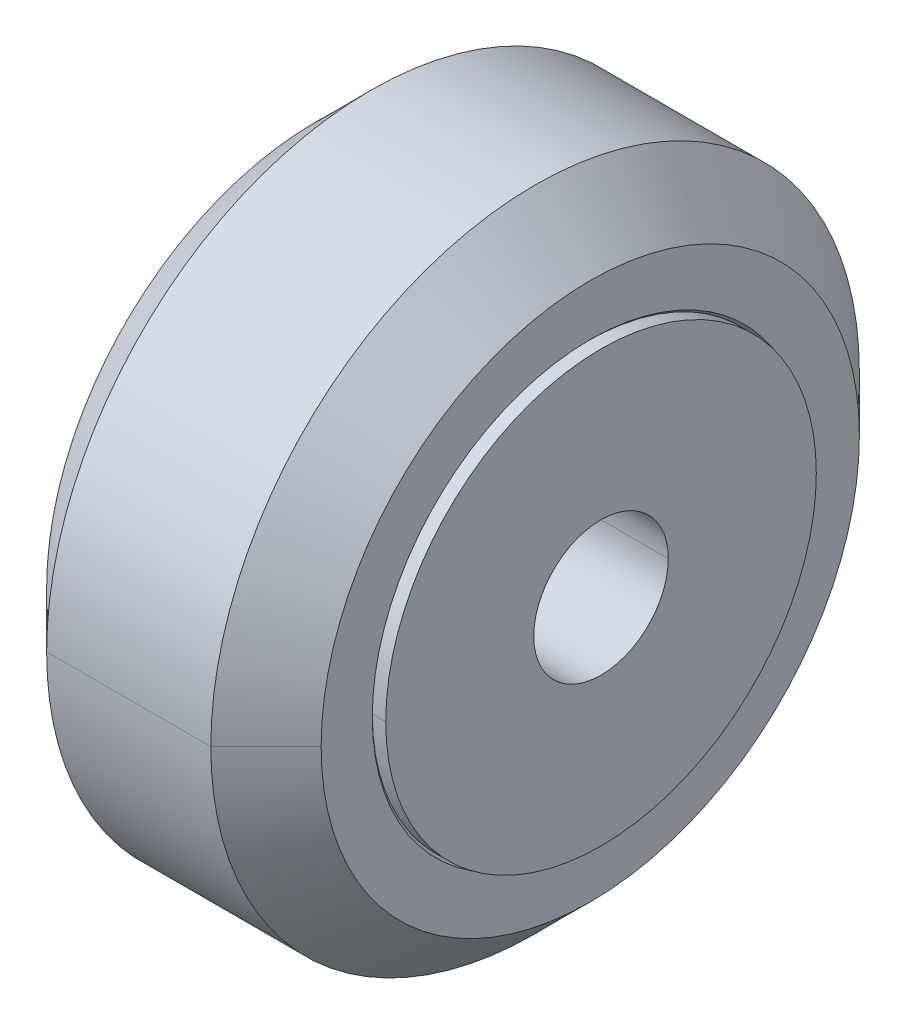
ISO-10303-21;
HEADER;
FILE_DESCRIPTION(('STEP AP214'),'2;1');
FILE_NAME('part.step','',(''),(''),'','','');
FILE_SCHEMA(('AUTOMOTIVE_DESIGN { 1 0 10303 214 1 1 1 1 }'));
ENDSEC;
DATA;
#1=APPLICATION_CONTEXT('core data for automotive mechanical design processes');
#2=APPLICATION_PROTOCOL_DEFINITION('international standard','automotive_design',2000,#1);
#3=PRODUCT_CONTEXT('',#1,'mechanical');
#4=PRODUCT('Part','Part','',(#3));
#5=PRODUCT_RELATED_PRODUCT_CATEGORY('part','',(#4));
#6=PRODUCT_DEFINITION_FORMATION('','',#4);
#7=PRODUCT_DEFINITION_CONTEXT('part definition',#1,'design');
#8=PRODUCT_DEFINITION('design','',#6,#7);
#9=PRODUCT_DEFINITION_SHAPE('','',#8);
#10=(LENGTH_UNIT() NAMED_UNIT(*) SI_UNIT(.MILLI.,.METRE.));
#11=(NAMED_UNIT(*) PLANE_ANGLE_UNIT() SI_UNIT($,.RADIAN.));
#12=(NAMED_UNIT(*) SI_UNIT($,.STERADIAN.) SOLID_ANGLE_UNIT());
#13=UNCERTAINTY_MEASURE_WITH_UNIT(LENGTH_MEASURE(1.E-05),#10,'distance_accuracy_value','');
#14=(GEOMETRIC_REPRESENTATION_CONTEXT(3) GLOBAL_UNCERTAINTY_ASSIGNED_CONTEXT((#13)) GLOBAL_UNIT_ASSIGNED_CONTEXT((#10,
#11,#12)) REPRESENTATION_CONTEXT('',''));
#15=CARTESIAN_POINT('',(0.,0.,0.));
#16=DIRECTION('',(0.,0.,1.));
#17=DIRECTION('',(1.,0.,0.));
#18=AXIS2_PLACEMENT_3D('',#15,#16,#17);
#19=CARTESIAN_POINT('',(-5.5,0.,0.));
#20=DIRECTION('',(1.,0.,0.));
#21=DIRECTION('',(0.,0.,-1.));
#22=AXIS2_PLACEMENT_3D('',#19,#20,#21);
#23=CYLINDRICAL_SURFACE('',#22,2.5);
#24=DIRECTION('',(1.,0.,0.));
#25=VECTOR('',#24,1.);
#26=CARTESIAN_POINT('',(-5.5,0.,2.5));
#27=LINE('',#26,#25);
#28=CARTESIAN_POINT('',(-5.5,0.,2.5));
#29=VERTEX_POINT('',#28);
#30=CARTESIAN_POINT('',(5.5,0.,2.5));
#31=VERTEX_POINT('',#30);
#32=EDGE_CURVE('E140',#29,#31,#27,.T.);
#33=ORIENTED_EDGE('',*,*,#32,.F.);
#34=CARTESIAN_POINT('',(-5.5,0.,0.));
#35=DIRECTION('',(1.,0.,0.));
#36=DIRECTION('',(0.,0.,-1.));
#37=AXIS2_PLACEMENT_3D('',#34,#35,#36);
#38=CIRCLE('',#37,2.5);
#39=CARTESIAN_POINT('',(-5.5,0.,-2.5));
#40=VERTEX_POINT('',#39);
#41=EDGE_CURVE('E10',#40,#29,#38,.T.);
#42=ORIENTED_EDGE('',*,*,#41,.F.);
#43=DIRECTION('',(1.,0.,0.));
#44=VECTOR('',#43,1.);
#45=CARTESIAN_POINT('',(-5.5,0.,-2.5));
#46=LINE('',#45,#44);
#47=CARTESIAN_POINT('',(5.5,0.,-2.5));
#48=VERTEX_POINT('',#47);
#49=EDGE_CURVE('E138',#40,#48,#46,.T.);
#50=ORIENTED_EDGE('',*,*,#49,.T.);
#51=CARTESIAN_POINT('',(5.5,0.,0.));
#52=DIRECTION('',(1.,0.,0.));
#53=DIRECTION('',(0.,0.,-1.));
#54=AXIS2_PLACEMENT_3D('',#51,#52,#53);
#55=CIRCLE('',#54,2.5);
#56=EDGE_CURVE('E133',#48,#31,#55,.T.);
#57=ORIENTED_EDGE('',*,*,#56,.T.);
#58=EDGE_LOOP('',(#33,#42,#50,#57));
#59=FACE_BOUND('',#58,.T.);
#60=ADVANCED_FACE('F16',(#59),#23,.F.);
#61=CARTESIAN_POINT('',(-5.5,0.,0.));
#62=DIRECTION('',(1.,0.,0.));
#63=DIRECTION('',(0.,1.,0.));
#64=AXIS2_PLACEMENT_3D('',#61,#62,#63);
#65=PLANE('',#64);
#66=ORIENTED_EDGE('',*,*,#41,.T.);
#67=CARTESIAN_POINT('',(-5.5,0.,0.));
#68=DIRECTION('',(1.,0.,0.));
#69=DIRECTION('',(0.,0.,-1.));
#70=AXIS2_PLACEMENT_3D('',#67,#68,#69);
#71=CIRCLE('',#70,2.5);
#72=EDGE_CURVE('E152',#29,#40,#71,.T.);
#73=ORIENTED_EDGE('',*,*,#72,.T.);
#74=EDGE_LOOP('',(#66,#73));
#75=FACE_BOUND('',#74,.T.);
#76=CARTESIAN_POINT('',(-5.5,0.,0.));
#77=DIRECTION('',(1.,0.,0.));
#78=DIRECTION('',(0.,0.,-1.));
#79=AXIS2_PLACEMENT_3D('',#76,#77,#78);
#80=CIRCLE('',#79,8.);
#81=CARTESIAN_POINT('',(-5.5,0.,8.));
#82=VERTEX_POINT('',#81);
#83=CARTESIAN_POINT('',(-5.5,0.,-8.));
#84=VERTEX_POINT('',#83);
#85=EDGE_CURVE('E24',#82,#84,#80,.T.);
#86=ORIENTED_EDGE('',*,*,#85,.F.);
#87=CARTESIAN_POINT('',(-5.5,0.,0.));
#88=DIRECTION('',(1.,0.,0.));
#89=DIRECTION('',(0.,0.,-1.));
#90=AXIS2_PLACEMENT_3D('',#87,#88,#89);
#91=CIRCLE('',#90,8.);
#92=EDGE_CURVE('E174',#84,#82,#91,.T.);
#93=ORIENTED_EDGE('',*,*,#92,.F.);
#94=EDGE_LOOP('',(#86,#93));
#95=FACE_BOUND('',#94,.T.);
#96=ADVANCED_FACE('F294',(#75,#95),#65,.F.);
#97=CARTESIAN_POINT('',(5.5,0.,0.));
#98=DIRECTION('',(-1.,0.,0.));
#99=DIRECTION('',(0.,0.,1.));
#100=AXIS2_PLACEMENT_3D('',#97,#98,#99);
#101=CYLINDRICAL_SURFACE('',#100,8.);
#102=DIRECTION('',(-1.,0.,0.));
#103=VECTOR('',#102,1.);
#104=CARTESIAN_POINT('',(5.5,0.,-8.));
#105=LINE('',#104,#103);
#106=CARTESIAN_POINT('',(-5.,0.,-8.));
#107=VERTEX_POINT('',#106);
#108=EDGE_CURVE('E167',#107,#84,#105,.T.);
#109=ORIENTED_EDGE('',*,*,#108,.F.);
#110=CARTESIAN_POINT('',(-5.,0.,0.));
#111=DIRECTION('',(-1.,0.,0.));
#112=DIRECTION('',(0.,0.,1.));
#113=AXIS2_PLACEMENT_3D('',#110,#111,#112);
#114=CIRCLE('',#113,8.);
#115=CARTESIAN_POINT('',(-5.,0.,8.));
#116=VERTEX_POINT('',#115);
#117=EDGE_CURVE('E251',#107,#116,#114,.T.);
#118=ORIENTED_EDGE('',*,*,#117,.T.);
#119=DIRECTION('',(-1.,0.,0.));
#120=VECTOR('',#119,1.);
#121=CARTESIAN_POINT('',(5.5,0.,8.));
#122=LINE('',#121,#120);
#123=EDGE_CURVE('E169',#116,#82,#122,.T.);
#124=ORIENTED_EDGE('',*,*,#123,.T.);
#125=ORIENTED_EDGE('',*,*,#85,.T.);
#126=EDGE_LOOP('',(#109,#118,#124,#125));
#127=FACE_BOUND('',#126,.T.);
#128=ADVANCED_FACE('F291',(#127),#101,.T.);
#129=CARTESIAN_POINT('',(5.5,0.,0.));
#130=DIRECTION('',(-1.,0.,0.));
#131=DIRECTION('',(0.,0.,1.));
#132=AXIS2_PLACEMENT_3D('',#129,#130,#131);
#133=CYLINDRICAL_SURFACE('',#132,8.);
#134=DIRECTION('',(-1.,0.,0.));
#135=VECTOR('',#134,1.);
#136=CARTESIAN_POINT('',(5.5,0.,-8.));
#137=LINE('',#136,#135);
#138=CARTESIAN_POINT('',(5.5,0.,-8.));
#139=VERTEX_POINT('',#138);
#140=CARTESIAN_POINT('',(5.,0.,-8.));
#141=VERTEX_POINT('',#140);
#142=EDGE_CURVE('E184',#139,#141,#137,.T.);
#143=ORIENTED_EDGE('',*,*,#142,.F.);
#144=CARTESIAN_POINT('',(5.5,0.,0.));
#145=DIRECTION('',(1.,0.,0.));
#146=DIRECTION('',(0.,0.,-1.));
#147=AXIS2_PLACEMENT_3D('',#144,#145,#146);
#148=CIRCLE('',#147,8.);
#149=CARTESIAN_POINT('',(5.5,0.,8.));
#150=VERTEX_POINT('',#149);
#151=EDGE_CURVE('E145',#150,#139,#148,.T.);
#152=ORIENTED_EDGE('',*,*,#151,.F.);
#153=DIRECTION('',(-1.,0.,0.));
#154=VECTOR('',#153,1.);
#155=CARTESIAN_POINT('',(5.5,0.,8.));
#156=LINE('',#155,#154);
#157=CARTESIAN_POINT('',(5.,0.,8.));
#158=VERTEX_POINT('',#157);
#159=EDGE_CURVE('E200',#150,#158,#156,.T.);
#160=ORIENTED_EDGE('',*,*,#159,.T.);
#161=CARTESIAN_POINT('',(5.,0.,0.));
#162=DIRECTION('',(1.,0.,0.));
#163=DIRECTION('',(0.,0.,-1.));
#164=AXIS2_PLACEMENT_3D('',#161,#162,#163);
#165=CIRCLE('',#164,8.);
#166=EDGE_CURVE('E236',#158,#141,#165,.T.);
#167=ORIENTED_EDGE('',*,*,#166,.T.);
#168=EDGE_LOOP('',(#143,#152,#160,#167));
#169=FACE_BOUND('',#168,.T.);
#170=ADVANCED_FACE('F351',(#169),#133,.T.);
#171=CARTESIAN_POINT('',(5.5,0.,0.));
#172=DIRECTION('',(1.,0.,0.));
#173=DIRECTION('',(0.,1.,0.));
#174=AXIS2_PLACEMENT_3D('',#171,#172,#173);
#175=PLANE('',#174);
#176=ORIENTED_EDGE('',*,*,#56,.F.);
#177=CARTESIAN_POINT('',(5.5,0.,0.));
#178=DIRECTION('',(1.,0.,0.));
#179=DIRECTION('',(0.,0.,-1.));
#180=AXIS2_PLACEMENT_3D('',#177,#178,#179);
#181=CIRCLE('',#180,2.5);
#182=EDGE_CURVE('E148',#31,#48,#181,.T.);
#183=ORIENTED_EDGE('',*,*,#182,.F.);
#184=EDGE_LOOP('',(#176,#183));
#185=FACE_BOUND('',#184,.T.);
#186=ORIENTED_EDGE('',*,*,#151,.T.);
#187=CARTESIAN_POINT('',(5.5,0.,0.));
#188=DIRECTION('',(1.,0.,0.));
#189=DIRECTION('',(0.,0.,-1.));
#190=AXIS2_PLACEMENT_3D('',#187,#188,#189);
#191=CIRCLE('',#190,8.);
#192=EDGE_CURVE('E172',#139,#150,#191,.T.);
#193=ORIENTED_EDGE('',*,*,#192,.T.);
#194=EDGE_LOOP('',(#186,#193));
#195=FACE_BOUND('',#194,.T.);
#196=ADVANCED_FACE('F150',(#185,#195),#175,.T.);
#197=CARTESIAN_POINT('',(-5.1,0.,0.));
#198=DIRECTION('',(-1.,0.,0.));
#199=DIRECTION('',(0.,0.,1.));
#200=AXIS2_PLACEMENT_3D('',#197,#198,#199);
#201=CONICAL_SURFACE('',#200,8.1,0.785398163397448);
#202=DIRECTION('',(-0.707106781186548,0.,-0.707106781186548));
#203=VECTOR('',#202,1.);
#204=CARTESIAN_POINT('',(-5.1,0.,-8.1));
#205=LINE('',#204,#203);
#206=CARTESIAN_POINT('',(-5.1,0.,-8.1));
#207=VERTEX_POINT('',#206);
#208=EDGE_CURVE('E260',#107,#207,#205,.T.);
#209=ORIENTED_EDGE('',*,*,#208,.F.);
#210=CARTESIAN_POINT('',(-5.,0.,0.));
#211=DIRECTION('',(-1.,0.,0.));
#212=DIRECTION('',(0.,0.,1.));
#213=AXIS2_PLACEMENT_3D('',#210,#211,#212);
#214=CIRCLE('',#213,8.);
#215=EDGE_CURVE('E162',#116,#107,#214,.T.);
#216=ORIENTED_EDGE('',*,*,#215,.F.);
#217=DIRECTION('',(-0.707106781186548,0.,0.707106781186548));
#218=VECTOR('',#217,1.);
#219=CARTESIAN_POINT('',(-5.1,0.,8.1));
#220=LINE('',#219,#218);
#221=CARTESIAN_POINT('',(-5.1,0.,8.1));
#222=VERTEX_POINT('',#221);
#223=EDGE_CURVE('E264',#116,#222,#220,.T.);
#224=ORIENTED_EDGE('',*,*,#223,.T.);
#225=CARTESIAN_POINT('',(-5.1,0.,0.));
#226=DIRECTION('',(-1.,0.,0.));
#227=DIRECTION('',(0.,0.,1.));
#228=AXIS2_PLACEMENT_3D('',#225,#226,#227);
#229=CIRCLE('',#228,8.1);
#230=EDGE_CURVE('E38',#222,#207,#229,.T.);
#231=ORIENTED_EDGE('',*,*,#230,.T.);
#232=EDGE_LOOP('',(#209,#216,#224,#231));
#233=FACE_BOUND('',#232,.T.);
#234=ADVANCED_FACE('F298',(#233),#201,.F.);
#235=CARTESIAN_POINT('',(5.1,0.,0.));
#236=DIRECTION('',(1.,0.,0.));
#237=DIRECTION('',(0.,0.,-1.));
#238=AXIS2_PLACEMENT_3D('',#235,#236,#237);
#239=CONICAL_SURFACE('',#238,8.1,0.785398163397448);
#240=DIRECTION('',(0.707106781186548,0.,0.707106781186548));
#241=VECTOR('',#240,1.);
#242=CARTESIAN_POINT('',(5.1,0.,8.1));
#243=LINE('',#242,#241);
#244=CARTESIAN_POINT('',(5.1,0.,8.1));
#245=VERTEX_POINT('',#244);
#246=EDGE_CURVE('E241',#158,#245,#243,.T.);
#247=ORIENTED_EDGE('',*,*,#246,.F.);
#248=CARTESIAN_POINT('',(5.,0.,0.));
#249=DIRECTION('',(1.,0.,0.));
#250=DIRECTION('',(0.,0.,-1.));
#251=AXIS2_PLACEMENT_3D('',#248,#249,#250);
#252=CIRCLE('',#251,8.);
#253=EDGE_CURVE('E193',#141,#158,#252,.T.);
#254=ORIENTED_EDGE('',*,*,#253,.F.);
#255=DIRECTION('',(0.707106781186548,0.,-0.707106781186548));
#256=VECTOR('',#255,1.);
#257=CARTESIAN_POINT('',(5.1,0.,-8.1));
#258=LINE('',#257,#256);
#259=CARTESIAN_POINT('',(5.1,0.,-8.1));
#260=VERTEX_POINT('',#259);
#261=EDGE_CURVE('E246',#141,#260,#258,.T.);
#262=ORIENTED_EDGE('',*,*,#261,.T.);
#263=CARTESIAN_POINT('',(5.1,0.,0.));
#264=DIRECTION('',(-1.,0.,0.));
#265=DIRECTION('',(0.,0.,-1.));
#266=AXIS2_PLACEMENT_3D('',#263,#264,#265);
#267=CIRCLE('',#266,8.1);
#268=EDGE_CURVE('E278',#245,#260,#267,.T.);
#269=ORIENTED_EDGE('',*,*,#268,.F.);
#270=EDGE_LOOP('',(#247,#254,#262,#269));
#271=FACE_BOUND('',#270,.T.);
#272=ADVANCED_FACE('F307',(#271),#239,.F.);
#273=CARTESIAN_POINT('',(-5.1,0.,0.));
#274=DIRECTION('',(1.,0.,0.));
#275=DIRECTION('',(0.,1.,0.));
#276=AXIS2_PLACEMENT_3D('',#273,#274,#275);
#277=PLANE('',#276);
#278=ORIENTED_EDGE('',*,*,#230,.F.);
#279=CARTESIAN_POINT('',(-5.1,0.,0.));
#280=DIRECTION('',(-1.,0.,0.));
#281=DIRECTION('',(0.,0.,1.));
#282=AXIS2_PLACEMENT_3D('',#279,#280,#281);
#283=CIRCLE('',#282,8.1);
#284=EDGE_CURVE('E261',#207,#222,#283,.T.);
#285=ORIENTED_EDGE('',*,*,#284,.F.);
#286=EDGE_LOOP('',(#278,#285));
#287=FACE_BOUND('',#286,.T.);
#288=CARTESIAN_POINT('',(-5.1,0.,0.));
#289=DIRECTION('',(1.,0.,0.));
#290=DIRECTION('',(0.,0.,-1.));
#291=AXIS2_PLACEMENT_3D('',#288,#289,#290);
#292=CIRCLE('',#291,10.);
#293=CARTESIAN_POINT('',(-5.1,0.,-10.));
#294=VERTEX_POINT('',#293);
#295=CARTESIAN_POINT('',(-5.1,0.,10.));
#296=VERTEX_POINT('',#295);
#297=EDGE_CURVE('E223',#294,#296,#292,.T.);
#298=ORIENTED_EDGE('',*,*,#297,.F.);
#299=CARTESIAN_POINT('',(-5.1,0.,0.));
#300=DIRECTION('',(1.,0.,0.));
#301=DIRECTION('',(0.,0.,-1.));
#302=AXIS2_PLACEMENT_3D('',#299,#300,#301);
#303=CIRCLE('',#302,10.);
#304=EDGE_CURVE('E280',#296,#294,#303,.T.);
#305=ORIENTED_EDGE('',*,*,#304,.F.);
#306=EDGE_LOOP('',(#298,#305));
#307=FACE_BOUND('',#306,.T.);
#308=ADVANCED_FACE('F304',(#287,#307),#277,.F.);
#309=CARTESIAN_POINT('',(5.1,0.,0.));
#310=DIRECTION('',(1.,0.,0.));
#311=DIRECTION('',(0.,1.,0.));
#312=AXIS2_PLACEMENT_3D('',#309,#310,#311);
#313=PLANE('',#312);
#314=CARTESIAN_POINT('',(5.1,0.,0.));
#315=DIRECTION('',(-1.,0.,0.));
#316=DIRECTION('',(0.,0.,-1.));
#317=AXIS2_PLACEMENT_3D('',#314,#315,#316);
#318=CIRCLE('',#317,8.1);
#319=EDGE_CURVE('E244',#260,#245,#318,.T.);
#320=ORIENTED_EDGE('',*,*,#319,.T.);
#321=ORIENTED_EDGE('',*,*,#268,.T.);
#322=EDGE_LOOP('',(#320,#321));
#323=FACE_BOUND('',#322,.T.);
#324=CARTESIAN_POINT('',(5.1,0.,0.));
#325=DIRECTION('',(-1.,0.,0.));
#326=DIRECTION('',(0.,0.,1.));
#327=AXIS2_PLACEMENT_3D('',#324,#325,#326);
#328=CIRCLE('',#327,10.);
#329=CARTESIAN_POINT('',(5.1,0.,10.));
#330=VERTEX_POINT('',#329);
#331=CARTESIAN_POINT('',(5.1,0.,-10.));
#332=VERTEX_POINT('',#331);
#333=EDGE_CURVE('E209',#330,#332,#328,.T.);
#334=ORIENTED_EDGE('',*,*,#333,.F.);
#335=CARTESIAN_POINT('',(5.1,0.,0.));
#336=DIRECTION('',(-1.,0.,0.));
#337=DIRECTION('',(0.,0.,1.));
#338=AXIS2_PLACEMENT_3D('',#335,#336,#337);
#339=CIRCLE('',#338,10.);
#340=EDGE_CURVE('E273',#332,#330,#339,.T.);
#341=ORIENTED_EDGE('',*,*,#340,.F.);
#342=EDGE_LOOP('',(#334,#341));
#343=FACE_BOUND('',#342,.T.);
#344=ADVANCED_FACE('F308',(#323,#343),#313,.T.);
#345=CARTESIAN_POINT('',(-3.05,0.,0.));
#346=DIRECTION('',(1.,0.,0.));
#347=DIRECTION('',(0.,0.,-1.));
#348=AXIS2_PLACEMENT_3D('',#345,#346,#347);
#349=CONICAL_SURFACE('',#348,12.05,0.785398163397448);
#350=DIRECTION('',(0.707106781186548,0.,0.707106781186548));
#351=VECTOR('',#350,1.);
#352=CARTESIAN_POINT('',(-3.05,0.,12.05));
#353=LINE('',#352,#351);
#354=CARTESIAN_POINT('',(-3.05,0.,12.05));
#355=VERTEX_POINT('',#354);
#356=EDGE_CURVE('E228',#296,#355,#353,.T.);
#357=ORIENTED_EDGE('',*,*,#356,.F.);
#358=ORIENTED_EDGE('',*,*,#304,.T.);
#359=DIRECTION('',(0.707106781186548,0.,-0.707106781186548));
#360=VECTOR('',#359,1.);
#361=CARTESIAN_POINT('',(-3.05,0.,-12.05));
#362=LINE('',#361,#360);
#363=CARTESIAN_POINT('',(-3.05,0.,-12.05));
#364=VERTEX_POINT('',#363);
#365=EDGE_CURVE('E234',#294,#364,#362,.T.);
#366=ORIENTED_EDGE('',*,*,#365,.T.);
#367=CARTESIAN_POINT('',(-3.05,0.,0.));
#368=DIRECTION('',(1.,0.,0.));
#369=DIRECTION('',(0.,0.,-1.));
#370=AXIS2_PLACEMENT_3D('',#367,#368,#369);
#371=CIRCLE('',#370,12.05);
#372=EDGE_CURVE('E268',#355,#364,#371,.T.);
#373=ORIENTED_EDGE('',*,*,#372,.F.);
#374=EDGE_LOOP('',(#357,#358,#366,#373));
#375=FACE_BOUND('',#374,.T.);
#376=ADVANCED_FACE('F318',(#375),#349,.T.);
#377=CARTESIAN_POINT('',(3.05,0.,0.));
#378=DIRECTION('',(-1.,0.,0.));
#379=DIRECTION('',(0.,0.,1.));
#380=AXIS2_PLACEMENT_3D('',#377,#378,#379);
#381=CONICAL_SURFACE('',#380,12.05,0.785398163397448);
#382=DIRECTION('',(-0.707106781186548,0.,-0.707106781186548));
#383=VECTOR('',#382,1.);
#384=CARTESIAN_POINT('',(3.05,0.,-12.05));
#385=LINE('',#384,#383);
#386=CARTESIAN_POINT('',(3.05,0.,-12.05));
#387=VERTEX_POINT('',#386);
#388=EDGE_CURVE('E220',#332,#387,#385,.T.);
#389=ORIENTED_EDGE('',*,*,#388,.F.);
#390=ORIENTED_EDGE('',*,*,#340,.T.);
#391=DIRECTION('',(-0.707106781186548,0.,0.707106781186548));
#392=VECTOR('',#391,1.);
#393=CARTESIAN_POINT('',(3.05,0.,12.05));
#394=LINE('',#393,#392);
#395=CARTESIAN_POINT('',(3.05,0.,12.05));
#396=VERTEX_POINT('',#395);
#397=EDGE_CURVE('E222',#330,#396,#394,.T.);
#398=ORIENTED_EDGE('',*,*,#397,.T.);
#399=CARTESIAN_POINT('',(3.05,0.,0.));
#400=DIRECTION('',(-1.,0.,0.));
#401=DIRECTION('',(0.,0.,-1.));
#402=AXIS2_PLACEMENT_3D('',#399,#400,#401);
#403=CIRCLE('',#402,12.05);
#404=EDGE_CURVE('E271',#387,#396,#403,.T.);
#405=ORIENTED_EDGE('',*,*,#404,.F.);
#406=EDGE_LOOP('',(#389,#390,#398,#405));
#407=FACE_BOUND('',#406,.T.);
#408=ADVANCED_FACE('F330',(#407),#381,.T.);
#409=CARTESIAN_POINT('',(-2.55,0.,0.));
#410=DIRECTION('',(1.,0.,0.));
#411=DIRECTION('',(0.,0.,-1.));
#412=AXIS2_PLACEMENT_3D('',#409,#410,#411);
#413=CYLINDRICAL_SURFACE('',#412,12.05);
#414=DIRECTION('',(1.,0.,0.));
#415=VECTOR('',#414,1.);
#416=CARTESIAN_POINT('',(-2.55,0.,12.05));
#417=LINE('',#416,#415);
#418=EDGE_CURVE('E192',#355,#396,#417,.T.);
#419=ORIENTED_EDGE('',*,*,#418,.F.);
#420=ORIENTED_EDGE('',*,*,#372,.T.);
#421=DIRECTION('',(1.,0.,0.));
#422=VECTOR('',#421,1.);
#423=CARTESIAN_POINT('',(-2.55,0.,-12.05));
#424=LINE('',#423,#422);
#425=EDGE_CURVE('E189',#364,#387,#424,.T.);
#426=ORIENTED_EDGE('',*,*,#425,.T.);
#427=ORIENTED_EDGE('',*,*,#404,.T.);
#428=EDGE_LOOP('',(#419,#420,#426,#427));
#429=FACE_BOUND('',#428,.T.);
#430=ADVANCED_FACE('F323',(#429),#413,.T.);
#431=CARTESIAN_POINT('',(-5.1,0.,0.));
#432=DIRECTION('',(-1.,0.,0.));
#433=DIRECTION('',(0.,0.,1.));
#434=AXIS2_PLACEMENT_3D('',#431,#432,#433);
#435=CONICAL_SURFACE('',#434,8.1,0.785398163397448);
#436=ORIENTED_EDGE('',*,*,#117,.F.);
#437=ORIENTED_EDGE('',*,*,#208,.T.);
#438=ORIENTED_EDGE('',*,*,#284,.T.);
#439=ORIENTED_EDGE('',*,*,#223,.F.);
#440=EDGE_LOOP('',(#436,#437,#438,#439));
#441=FACE_BOUND('',#440,.T.);
#442=ADVANCED_FACE('F305',(#441),#435,.F.);
#443=CARTESIAN_POINT('',(5.1,0.,0.));
#444=DIRECTION('',(1.,0.,0.));
#445=DIRECTION('',(0.,0.,-1.));
#446=AXIS2_PLACEMENT_3D('',#443,#444,#445);
#447=CONICAL_SURFACE('',#446,8.1,0.785398163397448);
#448=ORIENTED_EDGE('',*,*,#166,.F.);
#449=ORIENTED_EDGE('',*,*,#246,.T.);
#450=ORIENTED_EDGE('',*,*,#319,.F.);
#451=ORIENTED_EDGE('',*,*,#261,.F.);
#452=EDGE_LOOP('',(#448,#449,#450,#451));
#453=FACE_BOUND('',#452,.T.);
#454=ADVANCED_FACE('F377',(#453),#447,.F.);
#455=CARTESIAN_POINT('',(-3.05,0.,0.));
#456=DIRECTION('',(1.,0.,0.));
#457=DIRECTION('',(0.,0.,-1.));
#458=AXIS2_PLACEMENT_3D('',#455,#456,#457);
#459=CONICAL_SURFACE('',#458,12.05,0.785398163397448);
#460=ORIENTED_EDGE('',*,*,#297,.T.);
#461=ORIENTED_EDGE('',*,*,#356,.T.);
#462=CARTESIAN_POINT('',(-3.05,0.,0.));
#463=DIRECTION('',(1.,0.,0.));
#464=DIRECTION('',(0.,0.,-1.));
#465=AXIS2_PLACEMENT_3D('',#462,#463,#464);
#466=CIRCLE('',#465,12.05);
#467=EDGE_CURVE('E201',#364,#355,#466,.T.);
#468=ORIENTED_EDGE('',*,*,#467,.F.);
#469=ORIENTED_EDGE('',*,*,#365,.F.);
#470=EDGE_LOOP('',(#460,#461,#468,#469));
#471=FACE_BOUND('',#470,.T.);
#472=ADVANCED_FACE('F311',(#471),#459,.T.);
#473=CARTESIAN_POINT('',(3.05,0.,0.));
#474=DIRECTION('',(-1.,0.,0.));
#475=DIRECTION('',(0.,0.,1.));
#476=AXIS2_PLACEMENT_3D('',#473,#474,#475);
#477=CONICAL_SURFACE('',#476,12.05,0.785398163397448);
#478=ORIENTED_EDGE('',*,*,#333,.T.);
#479=ORIENTED_EDGE('',*,*,#388,.T.);
#480=CARTESIAN_POINT('',(3.05,0.,0.));
#481=DIRECTION('',(-1.,0.,0.));
#482=DIRECTION('',(0.,0.,-1.));
#483=AXIS2_PLACEMENT_3D('',#480,#481,#482);
#484=CIRCLE('',#483,12.05);
#485=EDGE_CURVE('E186',#396,#387,#484,.T.);
#486=ORIENTED_EDGE('',*,*,#485,.F.);
#487=ORIENTED_EDGE('',*,*,#397,.F.);
#488=EDGE_LOOP('',(#478,#479,#486,#487));
#489=FACE_BOUND('',#488,.T.);
#490=ADVANCED_FACE('F329',(#489),#477,.T.);
#491=CARTESIAN_POINT('',(-2.55,0.,0.));
#492=DIRECTION('',(1.,0.,0.));
#493=DIRECTION('',(0.,0.,-1.));
#494=AXIS2_PLACEMENT_3D('',#491,#492,#493);
#495=CYLINDRICAL_SURFACE('',#494,12.05);
#496=ORIENTED_EDGE('',*,*,#467,.T.);
#497=ORIENTED_EDGE('',*,*,#418,.T.);
#498=ORIENTED_EDGE('',*,*,#485,.T.);
#499=ORIENTED_EDGE('',*,*,#425,.F.);
#500=EDGE_LOOP('',(#496,#497,#498,#499));
#501=FACE_BOUND('',#500,.T.);
#502=ADVANCED_FACE('F319',(#501),#495,.T.);
#503=CARTESIAN_POINT('',(5.5,0.,0.));
#504=DIRECTION('',(-1.,0.,0.));
#505=DIRECTION('',(0.,0.,1.));
#506=AXIS2_PLACEMENT_3D('',#503,#504,#505);
#507=CYLINDRICAL_SURFACE('',#506,8.);
#508=ORIENTED_EDGE('',*,*,#192,.F.);
#509=ORIENTED_EDGE('',*,*,#142,.T.);
#510=ORIENTED_EDGE('',*,*,#253,.T.);
#511=ORIENTED_EDGE('',*,*,#159,.F.);
#512=EDGE_LOOP('',(#508,#509,#510,#511));
#513=FACE_BOUND('',#512,.T.);
#514=ADVANCED_FACE('F371',(#513),#507,.T.);
#515=CARTESIAN_POINT('',(5.5,0.,0.));
#516=DIRECTION('',(-1.,0.,0.));
#517=DIRECTION('',(0.,0.,1.));
#518=AXIS2_PLACEMENT_3D('',#515,#516,#517);
#519=CYLINDRICAL_SURFACE('',#518,8.);
#520=ORIENTED_EDGE('',*,*,#215,.T.);
#521=ORIENTED_EDGE('',*,*,#108,.T.);
#522=ORIENTED_EDGE('',*,*,#92,.T.);
#523=ORIENTED_EDGE('',*,*,#123,.F.);
#524=EDGE_LOOP('',(#520,#521,#522,#523));
#525=FACE_BOUND('',#524,.T.);
#526=ADVANCED_FACE('F300',(#525),#519,.T.);
#527=CARTESIAN_POINT('',(-5.5,0.,0.));
#528=DIRECTION('',(1.,0.,0.));
#529=DIRECTION('',(0.,0.,-1.));
#530=AXIS2_PLACEMENT_3D('',#527,#528,#529);
#531=CYLINDRICAL_SURFACE('',#530,2.5);
#532=ORIENTED_EDGE('',*,*,#72,.F.);
#533=ORIENTED_EDGE('',*,*,#32,.T.);
#534=ORIENTED_EDGE('',*,*,#182,.T.);
#535=ORIENTED_EDGE('',*,*,#49,.F.);
#536=EDGE_LOOP('',(#532,#533,#534,#535));
#537=FACE_BOUND('',#536,.T.);
#538=ADVANCED_FACE('F155',(#537),#531,.F.);
#539=CLOSED_SHELL('',(#60,#96,#128,#170,#196,#234,#272,#308,#344,#376,#408,#430,#442,#454,#472,
#490,#502,#514,#526,#538));
#540=MANIFOLD_SOLID_BREP('B1',#539);
#541=ADVANCED_BREP_SHAPE_REPRESENTATION('',(#18,#540),#14);
#542=SHAPE_DEFINITION_REPRESENTATION(#9,#541);
ENDSEC;
END-ISO-10303-21;
